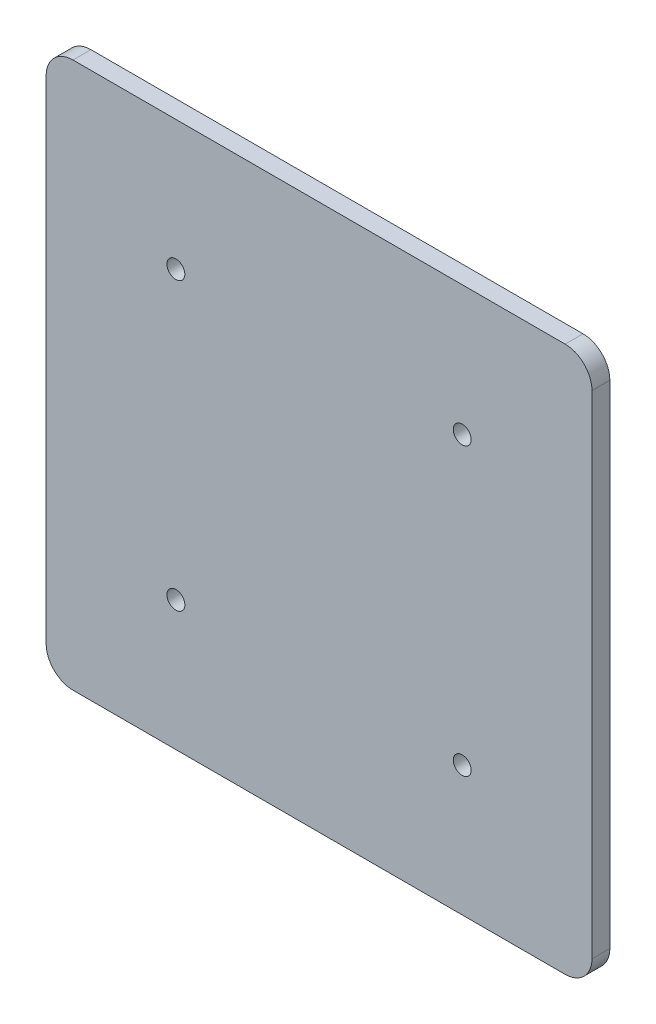
ISO-10303-21;
HEADER;
FILE_DESCRIPTION(('STEP AP214'),'2;1');
FILE_NAME('part.step','',(''),(''),'','','');
FILE_SCHEMA(('AUTOMOTIVE_DESIGN { 1 0 10303 214 1 1 1 1 }'));
ENDSEC;
DATA;
#1=APPLICATION_CONTEXT('core data for automotive mechanical design processes');
#2=APPLICATION_PROTOCOL_DEFINITION('international standard','automotive_design',2000,#1);
#3=PRODUCT_CONTEXT('',#1,'mechanical');
#4=PRODUCT('Part','Part','',(#3));
#5=PRODUCT_RELATED_PRODUCT_CATEGORY('part','',(#4));
#6=PRODUCT_DEFINITION_FORMATION('','',#4);
#7=PRODUCT_DEFINITION_CONTEXT('part definition',#1,'design');
#8=PRODUCT_DEFINITION('design','',#6,#7);
#9=PRODUCT_DEFINITION_SHAPE('','',#8);
#10=(LENGTH_UNIT() NAMED_UNIT(*) SI_UNIT(.MILLI.,.METRE.));
#11=(NAMED_UNIT(*) PLANE_ANGLE_UNIT() SI_UNIT($,.RADIAN.));
#12=(NAMED_UNIT(*) SI_UNIT($,.STERADIAN.) SOLID_ANGLE_UNIT());
#13=UNCERTAINTY_MEASURE_WITH_UNIT(LENGTH_MEASURE(1.E-05),#10,'distance_accuracy_value','');
#14=(GEOMETRIC_REPRESENTATION_CONTEXT(3) GLOBAL_UNCERTAINTY_ASSIGNED_CONTEXT((#13)) GLOBAL_UNIT_ASSIGNED_CONTEXT((#10,
#11,#12)) REPRESENTATION_CONTEXT('',''));
#15=CARTESIAN_POINT('',(0.,0.,0.));
#16=DIRECTION('',(0.,0.,1.));
#17=DIRECTION('',(1.,0.,0.));
#18=AXIS2_PLACEMENT_3D('',#15,#16,#17);
#19=CARTESIAN_POINT('',(-152.5,-152.5,10.));
#20=DIRECTION('',(1.,0.,0.));
#21=DIRECTION('',(0.,1.,0.));
#22=AXIS2_PLACEMENT_3D('',#19,#20,#21);
#23=PLANE('',#22);
#24=DIRECTION('',(0.,-1.,0.));
#25=VECTOR('',#24,1.);
#26=CARTESIAN_POINT('',(-152.5,-152.5,0.));
#27=LINE('',#26,#25);
#28=CARTESIAN_POINT('',(-152.5,137.5,0.));
#29=VERTEX_POINT('',#28);
#30=CARTESIAN_POINT('',(-152.5,-137.5,0.));
#31=VERTEX_POINT('',#30);
#32=EDGE_CURVE('E184',#29,#31,#27,.T.);
#33=ORIENTED_EDGE('',*,*,#32,.T.);
#34=DIRECTION('',(0.,0.,-1.));
#35=VECTOR('',#34,1.);
#36=CARTESIAN_POINT('',(-152.5,-137.5,10.));
#37=LINE('',#36,#35);
#38=CARTESIAN_POINT('',(-152.5,-137.5,10.));
#39=VERTEX_POINT('',#38);
#40=EDGE_CURVE('E11',#31,#39,#37,.F.);
#41=ORIENTED_EDGE('',*,*,#40,.T.);
#42=DIRECTION('',(0.,-1.,0.));
#43=VECTOR('',#42,1.);
#44=CARTESIAN_POINT('',(-152.5,-152.5,10.));
#45=LINE('',#44,#43);
#46=CARTESIAN_POINT('',(-152.5,137.5,10.));
#47=VERTEX_POINT('',#46);
#48=EDGE_CURVE('E137',#47,#39,#45,.T.);
#49=ORIENTED_EDGE('',*,*,#48,.F.);
#50=DIRECTION('',(0.,0.,-1.));
#51=VECTOR('',#50,1.);
#52=CARTESIAN_POINT('',(-152.5,137.5,10.));
#53=LINE('',#52,#51);
#54=EDGE_CURVE('E50',#47,#29,#53,.T.);
#55=ORIENTED_EDGE('',*,*,#54,.T.);
#56=EDGE_LOOP('',(#33,#41,#49,#55));
#57=FACE_BOUND('',#56,.T.);
#58=ADVANCED_FACE('F41',(#57),#23,.F.);
#59=CARTESIAN_POINT('',(-152.5,-152.5,10.));
#60=DIRECTION('',(0.,1.,0.));
#61=DIRECTION('',(0.,0.,1.));
#62=AXIS2_PLACEMENT_3D('',#59,#60,#61);
#63=PLANE('',#62);
#64=DIRECTION('',(1.,0.,0.));
#65=VECTOR('',#64,1.);
#66=CARTESIAN_POINT('',(-152.5,-152.5,0.));
#67=LINE('',#66,#65);
#68=CARTESIAN_POINT('',(-137.5,-152.5,0.));
#69=VERTEX_POINT('',#68);
#70=CARTESIAN_POINT('',(137.5,-152.5,0.));
#71=VERTEX_POINT('',#70);
#72=EDGE_CURVE('E144',#69,#71,#67,.T.);
#73=ORIENTED_EDGE('',*,*,#72,.T.);
#74=DIRECTION('',(0.,0.,-1.));
#75=VECTOR('',#74,1.);
#76=CARTESIAN_POINT('',(137.5,-152.5,10.));
#77=LINE('',#76,#75);
#78=CARTESIAN_POINT('',(137.5,-152.5,10.));
#79=VERTEX_POINT('',#78);
#80=EDGE_CURVE('E57',#71,#79,#77,.F.);
#81=ORIENTED_EDGE('',*,*,#80,.T.);
#82=DIRECTION('',(1.,0.,0.));
#83=VECTOR('',#82,1.);
#84=CARTESIAN_POINT('',(-152.5,-152.5,10.));
#85=LINE('',#84,#83);
#86=CARTESIAN_POINT('',(-137.5,-152.5,10.));
#87=VERTEX_POINT('',#86);
#88=EDGE_CURVE('E142',#87,#79,#85,.T.);
#89=ORIENTED_EDGE('',*,*,#88,.F.);
#90=DIRECTION('',(0.,0.,-1.));
#91=VECTOR('',#90,1.);
#92=CARTESIAN_POINT('',(-137.5,-152.5,10.));
#93=LINE('',#92,#91);
#94=EDGE_CURVE('E173',#87,#69,#93,.T.);
#95=ORIENTED_EDGE('',*,*,#94,.T.);
#96=EDGE_LOOP('',(#73,#81,#89,#95));
#97=FACE_BOUND('',#96,.T.);
#98=ADVANCED_FACE('F257',(#97),#63,.F.);
#99=CARTESIAN_POINT('',(152.5,-152.5,10.));
#100=DIRECTION('',(-1.,0.,0.));
#101=DIRECTION('',(0.,-1.,0.));
#102=AXIS2_PLACEMENT_3D('',#99,#100,#101);
#103=PLANE('',#102);
#104=DIRECTION('',(0.,1.,0.));
#105=VECTOR('',#104,1.);
#106=CARTESIAN_POINT('',(152.5,-152.5,0.));
#107=LINE('',#106,#105);
#108=CARTESIAN_POINT('',(152.5,-137.5,0.));
#109=VERTEX_POINT('',#108);
#110=CARTESIAN_POINT('',(152.5,137.5,0.));
#111=VERTEX_POINT('',#110);
#112=EDGE_CURVE('E138',#109,#111,#107,.T.);
#113=ORIENTED_EDGE('',*,*,#112,.T.);
#114=DIRECTION('',(0.,0.,-1.));
#115=VECTOR('',#114,1.);
#116=CARTESIAN_POINT('',(152.5,137.5,10.));
#117=LINE('',#116,#115);
#118=CARTESIAN_POINT('',(152.5,137.5,10.));
#119=VERTEX_POINT('',#118);
#120=EDGE_CURVE('E113',#111,#119,#117,.F.);
#121=ORIENTED_EDGE('',*,*,#120,.T.);
#122=DIRECTION('',(0.,1.,0.));
#123=VECTOR('',#122,1.);
#124=CARTESIAN_POINT('',(152.5,-152.5,10.));
#125=LINE('',#124,#123);
#126=CARTESIAN_POINT('',(152.5,-137.5,10.));
#127=VERTEX_POINT('',#126);
#128=EDGE_CURVE('E200',#127,#119,#125,.T.);
#129=ORIENTED_EDGE('',*,*,#128,.F.);
#130=DIRECTION('',(0.,0.,-1.));
#131=VECTOR('',#130,1.);
#132=CARTESIAN_POINT('',(152.5,-137.5,10.));
#133=LINE('',#132,#131);
#134=EDGE_CURVE('E119',#127,#109,#133,.T.);
#135=ORIENTED_EDGE('',*,*,#134,.T.);
#136=EDGE_LOOP('',(#113,#121,#129,#135));
#137=FACE_BOUND('',#136,.T.);
#138=ADVANCED_FACE('F254',(#137),#103,.F.);
#139=CARTESIAN_POINT('',(-152.5,152.5,10.));
#140=DIRECTION('',(0.,-1.,0.));
#141=DIRECTION('',(1.,0.,0.));
#142=AXIS2_PLACEMENT_3D('',#139,#140,#141);
#143=PLANE('',#142);
#144=DIRECTION('',(-1.,0.,0.));
#145=VECTOR('',#144,1.);
#146=CARTESIAN_POINT('',(-152.5,152.5,10.));
#147=LINE('',#146,#145);
#148=CARTESIAN_POINT('',(137.5,152.5,10.));
#149=VERTEX_POINT('',#148);
#150=CARTESIAN_POINT('',(-137.5,152.5,10.));
#151=VERTEX_POINT('',#150);
#152=EDGE_CURVE('E129',#149,#151,#147,.T.);
#153=ORIENTED_EDGE('',*,*,#152,.F.);
#154=DIRECTION('',(0.,0.,-1.));
#155=VECTOR('',#154,1.);
#156=CARTESIAN_POINT('',(137.5,152.5,10.));
#157=LINE('',#156,#155);
#158=CARTESIAN_POINT('',(137.5,152.5,0.));
#159=VERTEX_POINT('',#158);
#160=EDGE_CURVE('E112',#149,#159,#157,.T.);
#161=ORIENTED_EDGE('',*,*,#160,.T.);
#162=DIRECTION('',(-1.,0.,0.));
#163=VECTOR('',#162,1.);
#164=CARTESIAN_POINT('',(-152.5,152.5,0.));
#165=LINE('',#164,#163);
#166=CARTESIAN_POINT('',(-137.5,152.5,0.));
#167=VERTEX_POINT('',#166);
#168=EDGE_CURVE('E126',#159,#167,#165,.T.);
#169=ORIENTED_EDGE('',*,*,#168,.T.);
#170=DIRECTION('',(0.,0.,-1.));
#171=VECTOR('',#170,1.);
#172=CARTESIAN_POINT('',(-137.5,152.5,10.));
#173=LINE('',#172,#171);
#174=EDGE_CURVE('E132',#167,#151,#173,.F.);
#175=ORIENTED_EDGE('',*,*,#174,.T.);
#176=EDGE_LOOP('',(#153,#161,#169,#175));
#177=FACE_BOUND('',#176,.T.);
#178=ADVANCED_FACE('F125',(#177),#143,.F.);
#179=CARTESIAN_POINT('',(0.,0.,10.));
#180=DIRECTION('',(0.,0.,-1.));
#181=DIRECTION('',(-1.,0.,0.));
#182=AXIS2_PLACEMENT_3D('',#179,#180,#181);
#183=PLANE('',#182);
#184=CARTESIAN_POINT('',(-80.,80.,10.));
#185=DIRECTION('',(0.,0.,1.));
#186=DIRECTION('',(1.,0.,0.));
#187=AXIS2_PLACEMENT_3D('',#184,#185,#186);
#188=CIRCLE('',#187,5.00000000000001);
#189=CARTESIAN_POINT('',(-75.,80.,10.));
#190=VERTEX_POINT('',#189);
#191=EDGE_CURVE('E210',#190,#190,#188,.T.);
#192=ORIENTED_EDGE('',*,*,#191,.F.);
#193=EDGE_LOOP('',(#192));
#194=FACE_BOUND('',#193,.T.);
#195=CARTESIAN_POINT('',(-80.,-80.,10.));
#196=DIRECTION('',(0.,0.,1.));
#197=DIRECTION('',(1.,0.,0.));
#198=AXIS2_PLACEMENT_3D('',#195,#196,#197);
#199=CIRCLE('',#198,5.00000000000001);
#200=CARTESIAN_POINT('',(-75.,-80.,10.));
#201=VERTEX_POINT('',#200);
#202=EDGE_CURVE('E218',#201,#201,#199,.T.);
#203=ORIENTED_EDGE('',*,*,#202,.F.);
#204=EDGE_LOOP('',(#203));
#205=FACE_BOUND('',#204,.T.);
#206=CARTESIAN_POINT('',(80.,-80.,10.));
#207=DIRECTION('',(0.,0.,1.));
#208=DIRECTION('',(1.,0.,0.));
#209=AXIS2_PLACEMENT_3D('',#206,#207,#208);
#210=CIRCLE('',#209,5.00000000000001);
#211=CARTESIAN_POINT('',(85.,-80.,10.));
#212=VERTEX_POINT('',#211);
#213=EDGE_CURVE('E226',#212,#212,#210,.T.);
#214=ORIENTED_EDGE('',*,*,#213,.F.);
#215=EDGE_LOOP('',(#214));
#216=FACE_BOUND('',#215,.T.);
#217=CARTESIAN_POINT('',(80.,80.,10.));
#218=DIRECTION('',(0.,0.,1.));
#219=DIRECTION('',(1.,0.,0.));
#220=AXIS2_PLACEMENT_3D('',#217,#218,#219);
#221=CIRCLE('',#220,5.00000000000001);
#222=CARTESIAN_POINT('',(85.,80.,10.));
#223=VERTEX_POINT('',#222);
#224=EDGE_CURVE('E195',#223,#223,#221,.T.);
#225=ORIENTED_EDGE('',*,*,#224,.F.);
#226=EDGE_LOOP('',(#225));
#227=FACE_BOUND('',#226,.T.);
#228=ORIENTED_EDGE('',*,*,#128,.T.);
#229=CARTESIAN_POINT('',(137.5,137.5,10.));
#230=DIRECTION('',(0.,0.,-1.));
#231=DIRECTION('',(-1.,0.,0.));
#232=AXIS2_PLACEMENT_3D('',#229,#230,#231);
#233=CIRCLE('',#232,15.);
#234=EDGE_CURVE('E170',#119,#149,#233,.F.);
#235=ORIENTED_EDGE('',*,*,#234,.T.);
#236=ORIENTED_EDGE('',*,*,#152,.T.);
#237=CARTESIAN_POINT('',(-137.5,137.5,10.));
#238=DIRECTION('',(0.,0.,-1.));
#239=DIRECTION('',(-1.,0.,0.));
#240=AXIS2_PLACEMENT_3D('',#237,#238,#239);
#241=CIRCLE('',#240,15.);
#242=EDGE_CURVE('E162',#151,#47,#241,.F.);
#243=ORIENTED_EDGE('',*,*,#242,.T.);
#244=ORIENTED_EDGE('',*,*,#48,.T.);
#245=CARTESIAN_POINT('',(-137.5,-137.5,10.));
#246=DIRECTION('',(0.,0.,-1.));
#247=DIRECTION('',(-1.,0.,0.));
#248=AXIS2_PLACEMENT_3D('',#245,#246,#247);
#249=CIRCLE('',#248,15.);
#250=EDGE_CURVE('E64',#39,#87,#249,.F.);
#251=ORIENTED_EDGE('',*,*,#250,.T.);
#252=ORIENTED_EDGE('',*,*,#88,.T.);
#253=CARTESIAN_POINT('',(137.5,-137.5,10.));
#254=DIRECTION('',(0.,0.,-1.));
#255=DIRECTION('',(-1.,0.,0.));
#256=AXIS2_PLACEMENT_3D('',#253,#254,#255);
#257=CIRCLE('',#256,15.);
#258=EDGE_CURVE('E167',#79,#127,#257,.F.);
#259=ORIENTED_EDGE('',*,*,#258,.T.);
#260=EDGE_LOOP('',(#228,#235,#236,#243,#244,#251,#252,#259));
#261=FACE_BOUND('',#260,.T.);
#262=ADVANCED_FACE('F244',(#194,#205,#216,#227,#261),#183,.F.);
#263=CARTESIAN_POINT('',(0.,0.,0.));
#264=DIRECTION('',(0.,0.,-1.));
#265=DIRECTION('',(-1.,0.,0.));
#266=AXIS2_PLACEMENT_3D('',#263,#264,#265);
#267=PLANE('',#266);
#268=CARTESIAN_POINT('',(-80.,80.,0.));
#269=DIRECTION('',(0.,0.,1.));
#270=DIRECTION('',(1.,0.,0.));
#271=AXIS2_PLACEMENT_3D('',#268,#269,#270);
#272=CIRCLE('',#271,5.00000000000001);
#273=CARTESIAN_POINT('',(-75.,80.,0.));
#274=VERTEX_POINT('',#273);
#275=EDGE_CURVE('E214',#274,#274,#272,.T.);
#276=ORIENTED_EDGE('',*,*,#275,.T.);
#277=EDGE_LOOP('',(#276));
#278=FACE_BOUND('',#277,.T.);
#279=CARTESIAN_POINT('',(-80.,-80.,0.));
#280=DIRECTION('',(0.,0.,1.));
#281=DIRECTION('',(1.,0.,0.));
#282=AXIS2_PLACEMENT_3D('',#279,#280,#281);
#283=CIRCLE('',#282,5.00000000000001);
#284=CARTESIAN_POINT('',(-75.,-80.,0.));
#285=VERTEX_POINT('',#284);
#286=EDGE_CURVE('E222',#285,#285,#283,.T.);
#287=ORIENTED_EDGE('',*,*,#286,.T.);
#288=EDGE_LOOP('',(#287));
#289=FACE_BOUND('',#288,.T.);
#290=CARTESIAN_POINT('',(80.,-80.,0.));
#291=DIRECTION('',(0.,0.,1.));
#292=DIRECTION('',(1.,0.,0.));
#293=AXIS2_PLACEMENT_3D('',#290,#291,#292);
#294=CIRCLE('',#293,5.00000000000001);
#295=CARTESIAN_POINT('',(85.,-80.,0.));
#296=VERTEX_POINT('',#295);
#297=EDGE_CURVE('E208',#296,#296,#294,.T.);
#298=ORIENTED_EDGE('',*,*,#297,.T.);
#299=EDGE_LOOP('',(#298));
#300=FACE_BOUND('',#299,.T.);
#301=CARTESIAN_POINT('',(80.,80.,0.));
#302=DIRECTION('',(0.,0.,1.));
#303=DIRECTION('',(1.,0.,0.));
#304=AXIS2_PLACEMENT_3D('',#301,#302,#303);
#305=CIRCLE('',#304,5.00000000000001);
#306=CARTESIAN_POINT('',(85.,80.,0.));
#307=VERTEX_POINT('',#306);
#308=EDGE_CURVE('E190',#307,#307,#305,.T.);
#309=ORIENTED_EDGE('',*,*,#308,.T.);
#310=EDGE_LOOP('',(#309));
#311=FACE_BOUND('',#310,.T.);
#312=ORIENTED_EDGE('',*,*,#168,.F.);
#313=CARTESIAN_POINT('',(137.5,137.5,0.));
#314=DIRECTION('',(0.,0.,-1.));
#315=DIRECTION('',(-1.,0.,0.));
#316=AXIS2_PLACEMENT_3D('',#313,#314,#315);
#317=CIRCLE('',#316,15.);
#318=EDGE_CURVE('E108',#159,#111,#317,.T.);
#319=ORIENTED_EDGE('',*,*,#318,.T.);
#320=ORIENTED_EDGE('',*,*,#112,.F.);
#321=CARTESIAN_POINT('',(137.5,-137.5,0.));
#322=DIRECTION('',(0.,0.,-1.));
#323=DIRECTION('',(-1.,0.,0.));
#324=AXIS2_PLACEMENT_3D('',#321,#322,#323);
#325=CIRCLE('',#324,15.);
#326=EDGE_CURVE('E120',#109,#71,#325,.T.);
#327=ORIENTED_EDGE('',*,*,#326,.T.);
#328=ORIENTED_EDGE('',*,*,#72,.F.);
#329=CARTESIAN_POINT('',(-137.5,-137.5,0.));
#330=DIRECTION('',(0.,0.,-1.));
#331=DIRECTION('',(-1.,0.,0.));
#332=AXIS2_PLACEMENT_3D('',#329,#330,#331);
#333=CIRCLE('',#332,15.);
#334=EDGE_CURVE('E152',#69,#31,#333,.T.);
#335=ORIENTED_EDGE('',*,*,#334,.T.);
#336=ORIENTED_EDGE('',*,*,#32,.F.);
#337=CARTESIAN_POINT('',(-137.5,137.5,0.));
#338=DIRECTION('',(0.,0.,-1.));
#339=DIRECTION('',(-1.,0.,0.));
#340=AXIS2_PLACEMENT_3D('',#337,#338,#339);
#341=CIRCLE('',#340,15.);
#342=EDGE_CURVE('E131',#29,#167,#341,.T.);
#343=ORIENTED_EDGE('',*,*,#342,.T.);
#344=EDGE_LOOP('',(#312,#319,#320,#327,#328,#335,#336,#343));
#345=FACE_BOUND('',#344,.T.);
#346=ADVANCED_FACE('F134',(#278,#289,#300,#311,#345),#267,.T.);
#347=CARTESIAN_POINT('',(137.5,137.5,10.));
#348=DIRECTION('',(0.,0.,-1.));
#349=DIRECTION('',(-1.,0.,0.));
#350=AXIS2_PLACEMENT_3D('',#347,#348,#349);
#351=CYLINDRICAL_SURFACE('',#350,15.);
#352=ORIENTED_EDGE('',*,*,#234,.F.);
#353=ORIENTED_EDGE('',*,*,#120,.F.);
#354=ORIENTED_EDGE('',*,*,#318,.F.);
#355=ORIENTED_EDGE('',*,*,#160,.F.);
#356=EDGE_LOOP('',(#352,#353,#354,#355));
#357=FACE_BOUND('',#356,.T.);
#358=ADVANCED_FACE('F111',(#357),#351,.T.);
#359=CARTESIAN_POINT('',(137.5,-137.5,10.));
#360=DIRECTION('',(0.,0.,-1.));
#361=DIRECTION('',(-1.,0.,0.));
#362=AXIS2_PLACEMENT_3D('',#359,#360,#361);
#363=CYLINDRICAL_SURFACE('',#362,15.);
#364=ORIENTED_EDGE('',*,*,#258,.F.);
#365=ORIENTED_EDGE('',*,*,#80,.F.);
#366=ORIENTED_EDGE('',*,*,#326,.F.);
#367=ORIENTED_EDGE('',*,*,#134,.F.);
#368=EDGE_LOOP('',(#364,#365,#366,#367));
#369=FACE_BOUND('',#368,.T.);
#370=ADVANCED_FACE('F256',(#369),#363,.T.);
#371=CARTESIAN_POINT('',(-137.5,-137.5,10.));
#372=DIRECTION('',(0.,0.,-1.));
#373=DIRECTION('',(-1.,0.,0.));
#374=AXIS2_PLACEMENT_3D('',#371,#372,#373);
#375=CYLINDRICAL_SURFACE('',#374,15.);
#376=ORIENTED_EDGE('',*,*,#250,.F.);
#377=ORIENTED_EDGE('',*,*,#40,.F.);
#378=ORIENTED_EDGE('',*,*,#334,.F.);
#379=ORIENTED_EDGE('',*,*,#94,.F.);
#380=EDGE_LOOP('',(#376,#377,#378,#379));
#381=FACE_BOUND('',#380,.T.);
#382=ADVANCED_FACE('F260',(#381),#375,.T.);
#383=CARTESIAN_POINT('',(-137.5,137.5,10.));
#384=DIRECTION('',(0.,0.,-1.));
#385=DIRECTION('',(-1.,0.,0.));
#386=AXIS2_PLACEMENT_3D('',#383,#384,#385);
#387=CYLINDRICAL_SURFACE('',#386,15.);
#388=ORIENTED_EDGE('',*,*,#242,.F.);
#389=ORIENTED_EDGE('',*,*,#174,.F.);
#390=ORIENTED_EDGE('',*,*,#342,.F.);
#391=ORIENTED_EDGE('',*,*,#54,.F.);
#392=EDGE_LOOP('',(#388,#389,#390,#391));
#393=FACE_BOUND('',#392,.T.);
#394=ADVANCED_FACE('F43',(#393),#387,.T.);
#395=CARTESIAN_POINT('',(80.,80.,0.));
#396=DIRECTION('',(0.,0.,1.));
#397=DIRECTION('',(1.,0.,0.));
#398=AXIS2_PLACEMENT_3D('',#395,#396,#397);
#399=CYLINDRICAL_SURFACE('',#398,5.00000000000001);
#400=ORIENTED_EDGE('',*,*,#308,.F.);
#401=EDGE_LOOP('',(#400));
#402=FACE_BOUND('',#401,.T.);
#403=ORIENTED_EDGE('',*,*,#224,.T.);
#404=EDGE_LOOP('',(#403));
#405=FACE_BOUND('',#404,.T.);
#406=ADVANCED_FACE('F240',(#402,#405),#399,.F.);
#407=CARTESIAN_POINT('',(80.,-80.,0.));
#408=DIRECTION('',(0.,0.,1.));
#409=DIRECTION('',(1.,0.,0.));
#410=AXIS2_PLACEMENT_3D('',#407,#408,#409);
#411=CYLINDRICAL_SURFACE('',#410,5.00000000000001);
#412=ORIENTED_EDGE('',*,*,#297,.F.);
#413=EDGE_LOOP('',(#412));
#414=FACE_BOUND('',#413,.T.);
#415=ORIENTED_EDGE('',*,*,#213,.T.);
#416=EDGE_LOOP('',(#415));
#417=FACE_BOUND('',#416,.T.);
#418=ADVANCED_FACE('F236',(#414,#417),#411,.F.);
#419=CARTESIAN_POINT('',(-80.,-80.,0.));
#420=DIRECTION('',(0.,0.,1.));
#421=DIRECTION('',(1.,0.,0.));
#422=AXIS2_PLACEMENT_3D('',#419,#420,#421);
#423=CYLINDRICAL_SURFACE('',#422,5.00000000000001);
#424=ORIENTED_EDGE('',*,*,#286,.F.);
#425=EDGE_LOOP('',(#424));
#426=FACE_BOUND('',#425,.T.);
#427=ORIENTED_EDGE('',*,*,#202,.T.);
#428=EDGE_LOOP('',(#427));
#429=FACE_BOUND('',#428,.T.);
#430=ADVANCED_FACE('F239',(#426,#429),#423,.F.);
#431=CARTESIAN_POINT('',(-80.,80.,0.));
#432=DIRECTION('',(0.,0.,1.));
#433=DIRECTION('',(1.,0.,0.));
#434=AXIS2_PLACEMENT_3D('',#431,#432,#433);
#435=CYLINDRICAL_SURFACE('',#434,5.00000000000001);
#436=ORIENTED_EDGE('',*,*,#275,.F.);
#437=EDGE_LOOP('',(#436));
#438=FACE_BOUND('',#437,.T.);
#439=ORIENTED_EDGE('',*,*,#191,.T.);
#440=EDGE_LOOP('',(#439));
#441=FACE_BOUND('',#440,.T.);
#442=ADVANCED_FACE('F330',(#438,#441),#435,.F.);
#443=CLOSED_SHELL('',(#58,#98,#138,#178,#262,#346,#358,#370,#382,#394,#406,#418,#430,#442));
#444=MANIFOLD_SOLID_BREP('B2',#443);
#445=ADVANCED_BREP_SHAPE_REPRESENTATION('',(#18,#444),#14);
#446=SHAPE_DEFINITION_REPRESENTATION(#9,#445);
ENDSEC;
END-ISO-10303-21;
